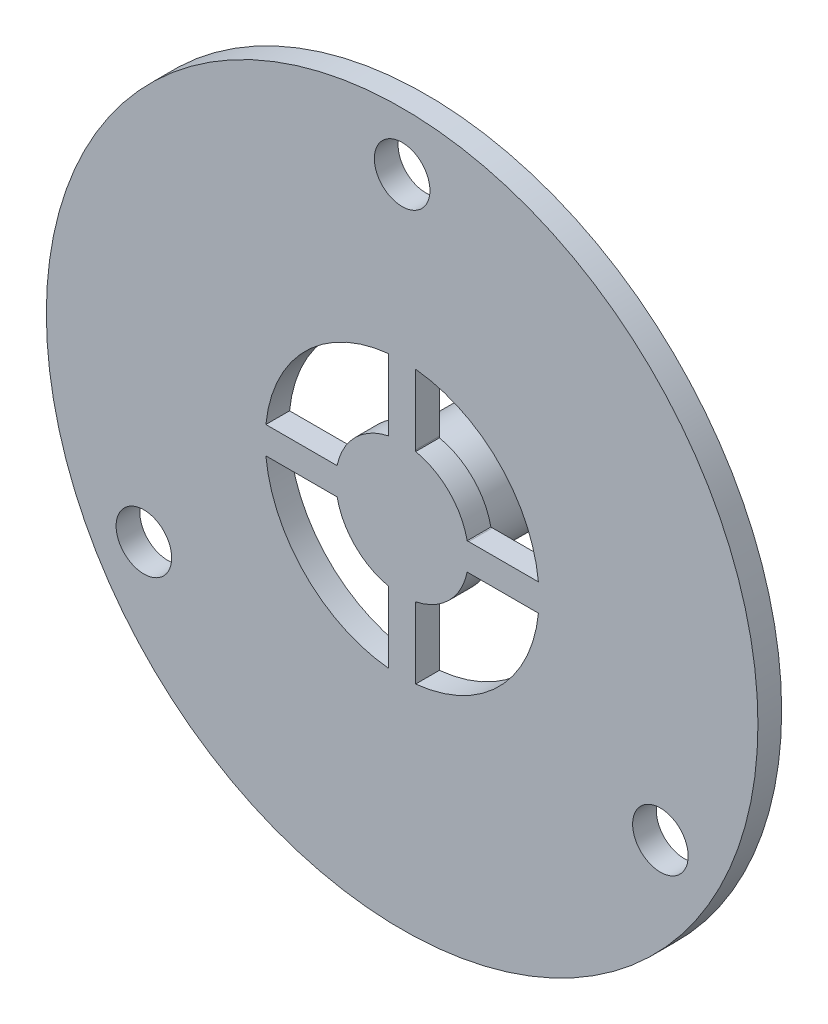
ISO-10303-21;
HEADER;
FILE_DESCRIPTION(('STEP AP214'),'2;1');
FILE_NAME('part.step','',(''),(''),'','','');
FILE_SCHEMA(('AUTOMOTIVE_DESIGN { 1 0 10303 214 1 1 1 1 }'));
ENDSEC;
DATA;
#1=APPLICATION_CONTEXT('core data for automotive mechanical design processes');
#2=APPLICATION_PROTOCOL_DEFINITION('international standard','automotive_design',2000,#1);
#3=PRODUCT_CONTEXT('',#1,'mechanical');
#4=PRODUCT('Part','Part','',(#3));
#5=PRODUCT_RELATED_PRODUCT_CATEGORY('part','',(#4));
#6=PRODUCT_DEFINITION_FORMATION('','',#4);
#7=PRODUCT_DEFINITION_CONTEXT('part definition',#1,'design');
#8=PRODUCT_DEFINITION('design','',#6,#7);
#9=PRODUCT_DEFINITION_SHAPE('','',#8);
#10=(LENGTH_UNIT() NAMED_UNIT(*) SI_UNIT(.MILLI.,.METRE.));
#11=(NAMED_UNIT(*) PLANE_ANGLE_UNIT() SI_UNIT($,.RADIAN.));
#12=(NAMED_UNIT(*) SI_UNIT($,.STERADIAN.) SOLID_ANGLE_UNIT());
#13=UNCERTAINTY_MEASURE_WITH_UNIT(LENGTH_MEASURE(1.E-05),#10,'distance_accuracy_value','');
#14=(GEOMETRIC_REPRESENTATION_CONTEXT(3) GLOBAL_UNCERTAINTY_ASSIGNED_CONTEXT((#13)) GLOBAL_UNIT_ASSIGNED_CONTEXT((#10,
#11,#12)) REPRESENTATION_CONTEXT('',''));
#15=CARTESIAN_POINT('',(0.,0.,0.));
#16=DIRECTION('',(0.,0.,1.));
#17=DIRECTION('',(1.,0.,0.));
#18=AXIS2_PLACEMENT_3D('',#15,#16,#17);
#19=CARTESIAN_POINT('',(0.,0.,11.8));
#20=DIRECTION('',(0.,0.,-1.));
#21=DIRECTION('',(-1.,0.,0.));
#22=AXIS2_PLACEMENT_3D('',#19,#20,#21);
#23=CYLINDRICAL_SURFACE('',#22,20.2072594216347);
#24=CARTESIAN_POINT('',(0.,0.,0.));
#25=DIRECTION('',(0.,0.,-1.));
#26=DIRECTION('',(-1.,0.,0.));
#27=AXIS2_PLACEMENT_3D('',#24,#25,#26);
#28=CIRCLE('',#27,20.2072594216347);
#29=CARTESIAN_POINT('',(-20.1079420213319,2.00099999999997,0.));
#30=VERTEX_POINT('',#29);
#31=CARTESIAN_POINT('',(-2.,20.1080415091387,0.));
#32=VERTEX_POINT('',#31);
#33=EDGE_CURVE('E379',#30,#32,#28,.T.);
#34=ORIENTED_EDGE('',*,*,#33,.T.);
#35=DIRECTION('',(0.,0.,-1.));
#36=VECTOR('',#35,1.);
#37=CARTESIAN_POINT('',(-2.,20.1080415091387,11.8));
#38=LINE('',#37,#36);
#39=CARTESIAN_POINT('',(-2.,20.1080415091387,3.5));
#40=VERTEX_POINT('',#39);
#41=EDGE_CURVE('E46',#32,#40,#38,.F.);
#42=ORIENTED_EDGE('',*,*,#41,.T.);
#43=CARTESIAN_POINT('',(0.,0.,3.5));
#44=DIRECTION('',(0.,0.,1.));
#45=DIRECTION('',(1.,0.,0.));
#46=AXIS2_PLACEMENT_3D('',#43,#44,#45);
#47=CIRCLE('',#46,20.2072594216347);
#48=CARTESIAN_POINT('',(-20.1079420213319,2.00099999999997,3.5));
#49=VERTEX_POINT('',#48);
#50=EDGE_CURVE('E388',#40,#49,#47,.T.);
#51=ORIENTED_EDGE('',*,*,#50,.T.);
#52=DIRECTION('',(0.,0.,-1.));
#53=VECTOR('',#52,1.);
#54=CARTESIAN_POINT('',(-20.1079420213319,2.00099999999997,11.8));
#55=LINE('',#54,#53);
#56=EDGE_CURVE('E410',#49,#30,#55,.T.);
#57=ORIENTED_EDGE('',*,*,#56,.T.);
#58=EDGE_LOOP('',(#34,#42,#51,#57));
#59=FACE_BOUND('',#58,.T.);
#60=ADVANCED_FACE('F38',(#59),#23,.F.);
#61=CARTESIAN_POINT('',(20.1081409467222,1.9990000000001,3.5));
#62=VERTEX_POINT('',#61);
#63=CARTESIAN_POINT('',(2.,20.1080415091387,3.5));
#64=VERTEX_POINT('',#63);
#65=EDGE_CURVE('E384',#62,#64,#47,.T.);
#66=ORIENTED_EDGE('',*,*,#65,.T.);
#67=DIRECTION('',(0.,0.,-1.));
#68=VECTOR('',#67,1.);
#69=CARTESIAN_POINT('',(2.,20.1080415091387,11.8));
#70=LINE('',#69,#68);
#71=CARTESIAN_POINT('',(2.,20.1080415091387,0.));
#72=VERTEX_POINT('',#71);
#73=EDGE_CURVE('E429',#64,#72,#70,.T.);
#74=ORIENTED_EDGE('',*,*,#73,.T.);
#75=CARTESIAN_POINT('',(20.1081409467222,1.9990000000001,0.));
#76=VERTEX_POINT('',#75);
#77=EDGE_CURVE('E383',#72,#76,#28,.T.);
#78=ORIENTED_EDGE('',*,*,#77,.T.);
#79=DIRECTION('',(0.,0.,-1.));
#80=VECTOR('',#79,1.);
#81=CARTESIAN_POINT('',(20.1081409467222,1.9990000000001,11.8));
#82=LINE('',#81,#80);
#83=EDGE_CURVE('E426',#76,#62,#82,.F.);
#84=ORIENTED_EDGE('',*,*,#83,.T.);
#85=EDGE_LOOP('',(#66,#74,#78,#84));
#86=FACE_BOUND('',#85,.T.);
#87=ADVANCED_FACE('F505',(#86),#23,.F.);
#88=CARTESIAN_POINT('',(1.99800000000007,-20.1082403340831,3.5));
#89=VERTEX_POINT('',#88);
#90=CARTESIAN_POINT('',(20.1079420213319,-2.0009999999999,3.5));
#91=VERTEX_POINT('',#90);
#92=EDGE_CURVE('E382',#89,#91,#47,.T.);
#93=ORIENTED_EDGE('',*,*,#92,.T.);
#94=DIRECTION('',(0.,0.,-1.));
#95=VECTOR('',#94,1.);
#96=CARTESIAN_POINT('',(20.1079420213319,-2.0009999999999,11.8));
#97=LINE('',#96,#95);
#98=CARTESIAN_POINT('',(20.1079420213319,-2.0009999999999,0.));
#99=VERTEX_POINT('',#98);
#100=EDGE_CURVE('E423',#91,#99,#97,.T.);
#101=ORIENTED_EDGE('',*,*,#100,.T.);
#102=CARTESIAN_POINT('',(1.99800000000007,-20.1082403340831,0.));
#103=VERTEX_POINT('',#102);
#104=EDGE_CURVE('E465',#99,#103,#28,.T.);
#105=ORIENTED_EDGE('',*,*,#104,.T.);
#106=DIRECTION('',(0.,0.,-1.));
#107=VECTOR('',#106,1.);
#108=CARTESIAN_POINT('',(1.99800000000007,-20.1082403340831,11.8));
#109=LINE('',#108,#107);
#110=EDGE_CURVE('E420',#103,#89,#109,.F.);
#111=ORIENTED_EDGE('',*,*,#110,.T.);
#112=EDGE_LOOP('',(#93,#101,#105,#111));
#113=FACE_BOUND('',#112,.T.);
#114=ADVANCED_FACE('F450',(#113),#23,.F.);
#115=CARTESIAN_POINT('',(0.,0.,3.5));
#116=DIRECTION('',(0.,0.,1.));
#117=DIRECTION('',(1.,0.,0.));
#118=AXIS2_PLACEMENT_3D('',#115,#116,#117);
#119=PLANE('',#118);
#120=ORIENTED_EDGE('',*,*,#50,.F.);
#121=DIRECTION('',(0.,1.,0.));
#122=VECTOR('',#121,1.);
#123=CARTESIAN_POINT('',(-2.,9.80418614976454,3.5));
#124=LINE('',#123,#122);
#125=CARTESIAN_POINT('',(-2.,9.80418614976454,3.5));
#126=VERTEX_POINT('',#125);
#127=EDGE_CURVE('E240',#126,#40,#124,.T.);
#128=ORIENTED_EDGE('',*,*,#127,.F.);
#129=DIRECTION('',(0.000101997246838848,0.999999994798281,0.));
#130=VECTOR('',#129,1.);
#131=CARTESIAN_POINT('',(-2.,9.80418614976454,3.5));
#132=LINE('',#131,#130);
#133=CARTESIAN_POINT('',(-2.00002102841153,9.59801968872468,3.5));
#134=VERTEX_POINT('',#133);
#135=EDGE_CURVE('E294',#134,#126,#132,.T.);
#136=ORIENTED_EDGE('',*,*,#135,.F.);
#137=CARTESIAN_POINT('',(0.,0.,3.5));
#138=DIRECTION('',(0.,0.,1.));
#139=DIRECTION('',(1.,0.,0.));
#140=AXIS2_PLACEMENT_3D('',#137,#138,#139);
#141=CIRCLE('',#140,9.80418614976454);
#142=CARTESIAN_POINT('',(-9.59782004958287,2.00097884922855,3.5));
#143=VERTEX_POINT('',#142);
#144=EDGE_CURVE('E299',#143,#134,#141,.F.);
#145=ORIENTED_EDGE('',*,*,#144,.F.);
#146=DIRECTION('',(0.999999994798281,-0.000101997246835377,0.));
#147=VECTOR('',#146,1.);
#148=CARTESIAN_POINT('',(-9.59782004958287,2.00097884922855,3.5));
#149=LINE('',#148,#147);
#150=CARTESIAN_POINT('',(-9.80518614976454,2.00099999999997,3.5));
#151=VERTEX_POINT('',#150);
#152=EDGE_CURVE('E303',#151,#143,#149,.T.);
#153=ORIENTED_EDGE('',*,*,#152,.F.);
#154=DIRECTION('',(1.,0.,0.));
#155=VECTOR('',#154,1.);
#156=CARTESIAN_POINT('',(-9.80518614976454,2.00099999999997,3.5));
#157=LINE('',#156,#155);
#158=EDGE_CURVE('E307',#49,#151,#157,.T.);
#159=ORIENTED_EDGE('',*,*,#158,.F.);
#160=EDGE_LOOP('',(#120,#128,#136,#145,#153,#159));
#161=FACE_BOUND('',#160,.T.);
#162=ORIENTED_EDGE('',*,*,#65,.F.);
#163=DIRECTION('',(1.,0.,0.));
#164=VECTOR('',#163,1.);
#165=CARTESIAN_POINT('',(9.80318614976454,1.9990000000001,3.5));
#166=LINE('',#165,#164);
#167=CARTESIAN_POINT('',(9.80318614976454,1.9990000000001,3.5));
#168=VERTEX_POINT('',#167);
#169=EDGE_CURVE('E343',#168,#62,#166,.T.);
#170=ORIENTED_EDGE('',*,*,#169,.F.);
#171=DIRECTION('',(0.999999994798281,-0.000101997246835749,0.));
#172=VECTOR('',#171,1.);
#173=CARTESIAN_POINT('',(9.80318614976454,1.9990000000001,3.5));
#174=LINE('',#173,#172);
#175=CARTESIAN_POINT('',(9.59822803854727,1.99902090516327,3.5));
#176=VERTEX_POINT('',#175);
#177=EDGE_CURVE('E346',#176,#168,#174,.T.);
#178=ORIENTED_EDGE('',*,*,#177,.F.);
#179=CARTESIAN_POINT('',(0.,0.,3.5));
#180=DIRECTION('',(0.,0.,1.));
#181=DIRECTION('',(1.,0.,0.));
#182=AXIS2_PLACEMENT_3D('',#179,#180,#181);
#183=CIRCLE('',#182,9.80418614976454);
#184=CARTESIAN_POINT('',(1.99997897248232,9.59802845218035,3.5));
#185=VERTEX_POINT('',#184);
#186=EDGE_CURVE('E350',#185,#176,#183,.F.);
#187=ORIENTED_EDGE('',*,*,#186,.F.);
#188=DIRECTION('',(-0.00010199724683881,-0.999999994798281,0.));
#189=VECTOR('',#188,1.);
#190=CARTESIAN_POINT('',(2.,9.80418614976454,3.5));
#191=LINE('',#190,#189);
#192=CARTESIAN_POINT('',(2.,9.80418614976454,3.5));
#193=VERTEX_POINT('',#192);
#194=EDGE_CURVE('E354',#193,#185,#191,.T.);
#195=ORIENTED_EDGE('',*,*,#194,.F.);
#196=DIRECTION('',(0.,-1.,0.));
#197=VECTOR('',#196,1.);
#198=CARTESIAN_POINT('',(2.,9.80418614976454,3.5));
#199=LINE('',#198,#197);
#200=EDGE_CURVE('E293',#64,#193,#199,.T.);
#201=ORIENTED_EDGE('',*,*,#200,.F.);
#202=EDGE_LOOP('',(#162,#170,#178,#187,#195,#201));
#203=FACE_BOUND('',#202,.T.);
#204=ORIENTED_EDGE('',*,*,#92,.F.);
#205=DIRECTION('',(0.,-1.,0.));
#206=VECTOR('',#205,1.);
#207=CARTESIAN_POINT('',(1.99800000000007,-9.80418614976454,3.5));
#208=LINE('',#207,#206);
#209=CARTESIAN_POINT('',(1.99800000000007,-9.80418614976454,3.5));
#210=VERTEX_POINT('',#209);
#211=EDGE_CURVE('E326',#210,#89,#208,.T.);
#212=ORIENTED_EDGE('',*,*,#211,.F.);
#213=DIRECTION('',(-0.000101997246838998,-0.999999994798281,0.));
#214=VECTOR('',#213,1.);
#215=CARTESIAN_POINT('',(1.9980209859248,-9.59843623717108,3.5));
#216=LINE('',#215,#214);
#217=CARTESIAN_POINT('',(1.9980209859248,-9.59843623717108,3.5));
#218=VERTEX_POINT('',#217);
#219=EDGE_CURVE('E329',#218,#210,#216,.T.);
#220=ORIENTED_EDGE('',*,*,#219,.F.);
#221=CARTESIAN_POINT('',(0.,0.,3.5));
#222=DIRECTION('',(0.,0.,1.));
#223=DIRECTION('',(1.,0.,0.));
#224=AXIS2_PLACEMENT_3D('',#221,#222,#223);
#225=CIRCLE('',#224,9.80418614976454);
#226=CARTESIAN_POINT('',(9.59782000705447,-2.00097905321864,3.5));
#227=VERTEX_POINT('',#226);
#228=EDGE_CURVE('E333',#227,#218,#225,.F.);
#229=ORIENTED_EDGE('',*,*,#228,.F.);
#230=DIRECTION('',(-0.999999994798281,0.000101997246834019,0.));
#231=VECTOR('',#230,1.);
#232=CARTESIAN_POINT('',(9.80318614976454,-2.0009999999999,3.5));
#233=LINE('',#232,#231);
#234=CARTESIAN_POINT('',(9.80318614976454,-2.0009999999999,3.5));
#235=VERTEX_POINT('',#234);
#236=EDGE_CURVE('E337',#235,#227,#233,.T.);
#237=ORIENTED_EDGE('',*,*,#236,.F.);
#238=DIRECTION('',(-1.,0.,0.));
#239=VECTOR('',#238,1.);
#240=CARTESIAN_POINT('',(9.80318614976454,-2.0009999999999,3.5));
#241=LINE('',#240,#239);
#242=EDGE_CURVE('E341',#91,#235,#241,.T.);
#243=ORIENTED_EDGE('',*,*,#242,.F.);
#244=EDGE_LOOP('',(#204,#212,#220,#229,#237,#243));
#245=FACE_BOUND('',#244,.T.);
#246=CARTESIAN_POINT('',(-20.1081409467222,-1.99900000000003,3.5));
#247=VERTEX_POINT('',#246);
#248=CARTESIAN_POINT('',(-2.00199999999993,-20.107842483301,3.5));
#249=VERTEX_POINT('',#248);
#250=EDGE_CURVE('E443',#247,#249,#47,.T.);
#251=ORIENTED_EDGE('',*,*,#250,.F.);
#252=DIRECTION('',(-1.,0.,0.));
#253=VECTOR('',#252,1.);
#254=CARTESIAN_POINT('',(-9.80518614976454,-1.99900000000003,3.5));
#255=LINE('',#254,#253);
#256=CARTESIAN_POINT('',(-9.80518614976454,-1.99900000000003,3.5));
#257=VERTEX_POINT('',#256);
#258=EDGE_CURVE('E309',#257,#247,#255,.T.);
#259=ORIENTED_EDGE('',*,*,#258,.F.);
#260=DIRECTION('',(-0.999999994798281,0.000101997246833554,0.));
#261=VECTOR('',#260,1.);
#262=CARTESIAN_POINT('',(-9.59822799606049,-1.99902110916203,3.5));
#263=LINE('',#262,#261);
#264=CARTESIAN_POINT('',(-9.59822799606049,-1.99902110916203,3.5));
#265=VERTEX_POINT('',#264);
#266=EDGE_CURVE('E312',#265,#257,#263,.T.);
#267=ORIENTED_EDGE('',*,*,#266,.F.);
#268=CARTESIAN_POINT('',(0.,0.,3.5));
#269=DIRECTION('',(0.,0.,1.));
#270=DIRECTION('',(1.,0.,0.));
#271=AXIS2_PLACEMENT_3D('',#268,#269,#270);
#272=CIRCLE('',#271,9.80418614976454);
#273=CARTESIAN_POINT('',(-2.00197892995385,-9.59761149574495,3.5));
#274=VERTEX_POINT('',#273);
#275=EDGE_CURVE('E316',#274,#265,#272,.F.);
#276=ORIENTED_EDGE('',*,*,#275,.F.);
#277=DIRECTION('',(0.000101997246839116,0.999999994798281,0.));
#278=VECTOR('',#277,1.);
#279=CARTESIAN_POINT('',(-2.00197892995385,-9.59761149574495,3.5));
#280=LINE('',#279,#278);
#281=CARTESIAN_POINT('',(-2.00199999999993,-9.80418614976454,3.5));
#282=VERTEX_POINT('',#281);
#283=EDGE_CURVE('E320',#282,#274,#280,.T.);
#284=ORIENTED_EDGE('',*,*,#283,.F.);
#285=DIRECTION('',(0.,1.,0.));
#286=VECTOR('',#285,1.);
#287=CARTESIAN_POINT('',(-2.00199999999993,-9.80418614976454,3.5));
#288=LINE('',#287,#286);
#289=EDGE_CURVE('E324',#249,#282,#288,.T.);
#290=ORIENTED_EDGE('',*,*,#289,.F.);
#291=EDGE_LOOP('',(#251,#259,#267,#276,#284,#290));
#292=FACE_BOUND('',#291,.T.);
#293=CARTESIAN_POINT('',(38.1051177665152,-22.0000000000002,3.5));
#294=DIRECTION('',(0.,0.,1.));
#295=DIRECTION('',(1.,0.,0.));
#296=AXIS2_PLACEMENT_3D('',#293,#294,#295);
#297=CIRCLE('',#296,4.09999999999997);
#298=CARTESIAN_POINT('',(42.2051177665152,-22.0000000000002,3.5));
#299=VERTEX_POINT('',#298);
#300=EDGE_CURVE('E395',#299,#299,#297,.T.);
#301=ORIENTED_EDGE('',*,*,#300,.F.);
#302=EDGE_LOOP('',(#301));
#303=FACE_BOUND('',#302,.T.);
#304=CARTESIAN_POINT('',(0.,0.,3.5));
#305=DIRECTION('',(0.,0.,1.));
#306=DIRECTION('',(1.,0.,0.));
#307=AXIS2_PLACEMENT_3D('',#304,#305,#306);
#308=CIRCLE('',#307,52.5);
#309=CARTESIAN_POINT('',(52.5,0.,3.5));
#310=VERTEX_POINT('',#309);
#311=EDGE_CURVE('E407',#310,#310,#308,.T.);
#312=ORIENTED_EDGE('',*,*,#311,.T.);
#313=EDGE_LOOP('',(#312));
#314=FACE_BOUND('',#313,.T.);
#315=CARTESIAN_POINT('',(0.,44.,3.5));
#316=DIRECTION('',(0.,0.,1.));
#317=DIRECTION('',(1.,0.,0.));
#318=AXIS2_PLACEMENT_3D('',#315,#316,#317);
#319=CIRCLE('',#318,4.1);
#320=CARTESIAN_POINT('',(4.10000000000001,44.,3.5));
#321=VERTEX_POINT('',#320);
#322=EDGE_CURVE('E401',#321,#321,#319,.T.);
#323=ORIENTED_EDGE('',*,*,#322,.F.);
#324=EDGE_LOOP('',(#323));
#325=FACE_BOUND('',#324,.T.);
#326=CARTESIAN_POINT('',(-38.1051177665152,-22.0000000000002,3.5));
#327=DIRECTION('',(0.,0.,1.));
#328=DIRECTION('',(1.,0.,0.));
#329=AXIS2_PLACEMENT_3D('',#326,#327,#328);
#330=CIRCLE('',#329,4.10000000000001);
#331=CARTESIAN_POINT('',(-34.0051177665152,-22.0000000000002,3.5));
#332=VERTEX_POINT('',#331);
#333=EDGE_CURVE('E389',#332,#332,#330,.T.);
#334=ORIENTED_EDGE('',*,*,#333,.F.);
#335=EDGE_LOOP('',(#334));
#336=FACE_BOUND('',#335,.T.);
#337=ADVANCED_FACE('F440',(#161,#203,#245,#292,#303,#314,#325,#336),#119,.T.);
#338=CARTESIAN_POINT('',(0.,0.,0.));
#339=DIRECTION('',(0.,0.,1.));
#340=DIRECTION('',(1.,0.,0.));
#341=AXIS2_PLACEMENT_3D('',#338,#339,#340);
#342=PLANE('',#341);
#343=CARTESIAN_POINT('',(0.,0.,0.));
#344=DIRECTION('',(0.,0.,1.));
#345=DIRECTION('',(1.,0.,0.));
#346=AXIS2_PLACEMENT_3D('',#343,#344,#345);
#347=CIRCLE('',#346,7.78176214693333);
#348=CARTESIAN_POINT('',(7.78176214693333,0.,0.));
#349=VERTEX_POINT('',#348);
#350=EDGE_CURVE('E11',#349,#349,#347,.F.);
#351=ORIENTED_EDGE('',*,*,#350,.F.);
#352=EDGE_LOOP('',(#351));
#353=FACE_BOUND('',#352,.T.);
#354=DIRECTION('',(0.,1.,0.));
#355=VECTOR('',#354,1.);
#356=CARTESIAN_POINT('',(-2.,9.80418614976454,0.));
#357=LINE('',#356,#355);
#358=CARTESIAN_POINT('',(-2.,9.80418614976454,0.));
#359=VERTEX_POINT('',#358);
#360=EDGE_CURVE('E287',#359,#32,#357,.T.);
#361=ORIENTED_EDGE('',*,*,#360,.T.);
#362=ORIENTED_EDGE('',*,*,#33,.F.);
#363=DIRECTION('',(1.,0.,0.));
#364=VECTOR('',#363,1.);
#365=CARTESIAN_POINT('',(-9.80518614976454,2.00099999999997,0.));
#366=LINE('',#365,#364);
#367=CARTESIAN_POINT('',(-9.80518614976454,2.00099999999997,0.));
#368=VERTEX_POINT('',#367);
#369=EDGE_CURVE('E244',#30,#368,#366,.T.);
#370=ORIENTED_EDGE('',*,*,#369,.T.);
#371=DIRECTION('',(0.999999994798281,-0.000101997246835377,0.));
#372=VECTOR('',#371,1.);
#373=CARTESIAN_POINT('',(-9.59782004958287,2.00097884922855,0.));
#374=LINE('',#373,#372);
#375=CARTESIAN_POINT('',(-9.59782004958287,2.00097884922855,0.));
#376=VERTEX_POINT('',#375);
#377=EDGE_CURVE('E241',#368,#376,#374,.T.);
#378=ORIENTED_EDGE('',*,*,#377,.T.);
#379=CARTESIAN_POINT('',(0.,0.,0.));
#380=DIRECTION('',(0.,0.,-1.));
#381=DIRECTION('',(-1.,0.,0.));
#382=AXIS2_PLACEMENT_3D('',#379,#380,#381);
#383=CIRCLE('',#382,9.80418614976454);
#384=CARTESIAN_POINT('',(-2.00002102841153,9.59801968872468,0.));
#385=VERTEX_POINT('',#384);
#386=EDGE_CURVE('E237',#376,#385,#383,.T.);
#387=ORIENTED_EDGE('',*,*,#386,.T.);
#388=DIRECTION('',(0.000101997246838848,0.999999994798281,0.));
#389=VECTOR('',#388,1.);
#390=CARTESIAN_POINT('',(-2.,9.80418614976454,0.));
#391=LINE('',#390,#389);
#392=EDGE_CURVE('E219',#385,#359,#391,.T.);
#393=ORIENTED_EDGE('',*,*,#392,.T.);
#394=EDGE_LOOP('',(#361,#362,#370,#378,#387,#393));
#395=FACE_BOUND('',#394,.T.);
#396=DIRECTION('',(1.,0.,0.));
#397=VECTOR('',#396,1.);
#398=CARTESIAN_POINT('',(9.80318614976454,1.9990000000001,0.));
#399=LINE('',#398,#397);
#400=CARTESIAN_POINT('',(9.80318614976454,1.9990000000001,0.));
#401=VERTEX_POINT('',#400);
#402=EDGE_CURVE('E273',#401,#76,#399,.T.);
#403=ORIENTED_EDGE('',*,*,#402,.T.);
#404=ORIENTED_EDGE('',*,*,#77,.F.);
#405=DIRECTION('',(0.,-1.,0.));
#406=VECTOR('',#405,1.);
#407=CARTESIAN_POINT('',(2.,9.80418614976454,0.));
#408=LINE('',#407,#406);
#409=CARTESIAN_POINT('',(2.,9.80418614976454,0.));
#410=VERTEX_POINT('',#409);
#411=EDGE_CURVE('E285',#72,#410,#408,.T.);
#412=ORIENTED_EDGE('',*,*,#411,.T.);
#413=DIRECTION('',(-0.00010199724683881,-0.999999994798281,0.));
#414=VECTOR('',#413,1.);
#415=CARTESIAN_POINT('',(2.,9.80418614976454,0.));
#416=LINE('',#415,#414);
#417=CARTESIAN_POINT('',(1.99997897248232,9.59802845218035,0.));
#418=VERTEX_POINT('',#417);
#419=EDGE_CURVE('E282',#410,#418,#416,.T.);
#420=ORIENTED_EDGE('',*,*,#419,.T.);
#421=CARTESIAN_POINT('',(0.,0.,0.));
#422=DIRECTION('',(0.,0.,-1.));
#423=DIRECTION('',(-1.,0.,0.));
#424=AXIS2_PLACEMENT_3D('',#421,#422,#423);
#425=CIRCLE('',#424,9.80418614976454);
#426=CARTESIAN_POINT('',(9.59822803854727,1.99902090516327,0.));
#427=VERTEX_POINT('',#426);
#428=EDGE_CURVE('E279',#418,#427,#425,.T.);
#429=ORIENTED_EDGE('',*,*,#428,.T.);
#430=DIRECTION('',(0.999999994798281,-0.000101997246835749,0.));
#431=VECTOR('',#430,1.);
#432=CARTESIAN_POINT('',(9.80318614976454,1.9990000000001,0.));
#433=LINE('',#432,#431);
#434=EDGE_CURVE('E276',#427,#401,#433,.T.);
#435=ORIENTED_EDGE('',*,*,#434,.T.);
#436=EDGE_LOOP('',(#403,#404,#412,#420,#429,#435));
#437=FACE_BOUND('',#436,.T.);
#438=DIRECTION('',(0.,-1.,0.));
#439=VECTOR('',#438,1.);
#440=CARTESIAN_POINT('',(1.99800000000007,-9.80418614976454,0.));
#441=LINE('',#440,#439);
#442=CARTESIAN_POINT('',(1.99800000000007,-9.80418614976454,0.));
#443=VERTEX_POINT('',#442);
#444=EDGE_CURVE('E259',#443,#103,#441,.T.);
#445=ORIENTED_EDGE('',*,*,#444,.T.);
#446=ORIENTED_EDGE('',*,*,#104,.F.);
#447=DIRECTION('',(-1.,0.,0.));
#448=VECTOR('',#447,1.);
#449=CARTESIAN_POINT('',(9.80318614976454,-2.0009999999999,0.));
#450=LINE('',#449,#448);
#451=CARTESIAN_POINT('',(9.80318614976454,-2.0009999999999,0.));
#452=VERTEX_POINT('',#451);
#453=EDGE_CURVE('E271',#99,#452,#450,.T.);
#454=ORIENTED_EDGE('',*,*,#453,.T.);
#455=DIRECTION('',(-0.999999994798281,0.000101997246834019,0.));
#456=VECTOR('',#455,1.);
#457=CARTESIAN_POINT('',(9.80318614976454,-2.0009999999999,0.));
#458=LINE('',#457,#456);
#459=CARTESIAN_POINT('',(9.59782000705447,-2.00097905321864,0.));
#460=VERTEX_POINT('',#459);
#461=EDGE_CURVE('E268',#452,#460,#458,.T.);
#462=ORIENTED_EDGE('',*,*,#461,.T.);
#463=CARTESIAN_POINT('',(0.,0.,0.));
#464=DIRECTION('',(0.,0.,-1.));
#465=DIRECTION('',(-1.,0.,0.));
#466=AXIS2_PLACEMENT_3D('',#463,#464,#465);
#467=CIRCLE('',#466,9.80418614976454);
#468=CARTESIAN_POINT('',(1.9980209859248,-9.59843623717108,0.));
#469=VERTEX_POINT('',#468);
#470=EDGE_CURVE('E265',#460,#469,#467,.T.);
#471=ORIENTED_EDGE('',*,*,#470,.T.);
#472=DIRECTION('',(-0.000101997246838998,-0.999999994798281,0.));
#473=VECTOR('',#472,1.);
#474=CARTESIAN_POINT('',(1.9980209859248,-9.59843623717108,0.));
#475=LINE('',#474,#473);
#476=EDGE_CURVE('E262',#469,#443,#475,.T.);
#477=ORIENTED_EDGE('',*,*,#476,.T.);
#478=EDGE_LOOP('',(#445,#446,#454,#462,#471,#477));
#479=FACE_BOUND('',#478,.T.);
#480=DIRECTION('',(-1.,0.,0.));
#481=VECTOR('',#480,1.);
#482=CARTESIAN_POINT('',(-9.80518614976454,-1.99900000000003,0.));
#483=LINE('',#482,#481);
#484=CARTESIAN_POINT('',(-9.80518614976454,-1.99900000000003,0.));
#485=VERTEX_POINT('',#484);
#486=CARTESIAN_POINT('',(-20.1081409467222,-1.99900000000003,0.));
#487=VERTEX_POINT('',#486);
#488=EDGE_CURVE('E246',#485,#487,#483,.T.);
#489=ORIENTED_EDGE('',*,*,#488,.T.);
#490=CARTESIAN_POINT('',(-2.00199999999993,-20.107842483301,0.));
#491=VERTEX_POINT('',#490);
#492=EDGE_CURVE('E378',#491,#487,#28,.T.);
#493=ORIENTED_EDGE('',*,*,#492,.F.);
#494=DIRECTION('',(0.,1.,0.));
#495=VECTOR('',#494,1.);
#496=CARTESIAN_POINT('',(-2.00199999999993,-9.80418614976454,0.));
#497=LINE('',#496,#495);
#498=CARTESIAN_POINT('',(-2.00199999999993,-9.80418614976454,0.));
#499=VERTEX_POINT('',#498);
#500=EDGE_CURVE('E60',#491,#499,#497,.T.);
#501=ORIENTED_EDGE('',*,*,#500,.T.);
#502=DIRECTION('',(0.000101997246839116,0.999999994798281,0.));
#503=VECTOR('',#502,1.);
#504=CARTESIAN_POINT('',(-2.00197892995385,-9.59761149574495,0.));
#505=LINE('',#504,#503);
#506=CARTESIAN_POINT('',(-2.00197892995385,-9.59761149574495,0.));
#507=VERTEX_POINT('',#506);
#508=EDGE_CURVE('E255',#499,#507,#505,.T.);
#509=ORIENTED_EDGE('',*,*,#508,.T.);
#510=CARTESIAN_POINT('',(0.,0.,0.));
#511=DIRECTION('',(0.,0.,-1.));
#512=DIRECTION('',(-1.,0.,0.));
#513=AXIS2_PLACEMENT_3D('',#510,#511,#512);
#514=CIRCLE('',#513,9.80418614976454);
#515=CARTESIAN_POINT('',(-9.59822799606049,-1.99902110916203,0.));
#516=VERTEX_POINT('',#515);
#517=EDGE_CURVE('E252',#507,#516,#514,.T.);
#518=ORIENTED_EDGE('',*,*,#517,.T.);
#519=DIRECTION('',(-0.999999994798281,0.000101997246833554,0.));
#520=VECTOR('',#519,1.);
#521=CARTESIAN_POINT('',(-9.59822799606049,-1.99902110916203,0.));
#522=LINE('',#521,#520);
#523=EDGE_CURVE('E249',#516,#485,#522,.T.);
#524=ORIENTED_EDGE('',*,*,#523,.T.);
#525=EDGE_LOOP('',(#489,#493,#501,#509,#518,#524));
#526=FACE_BOUND('',#525,.T.);
#527=CARTESIAN_POINT('',(-38.1051177665152,-22.0000000000002,0.));
#528=DIRECTION('',(0.,0.,1.));
#529=DIRECTION('',(1.,0.,0.));
#530=AXIS2_PLACEMENT_3D('',#527,#528,#529);
#531=CIRCLE('',#530,4.10000000000001);
#532=CARTESIAN_POINT('',(-34.0051177665152,-22.0000000000002,0.));
#533=VERTEX_POINT('',#532);
#534=EDGE_CURVE('E387',#533,#533,#531,.T.);
#535=ORIENTED_EDGE('',*,*,#534,.T.);
#536=EDGE_LOOP('',(#535));
#537=FACE_BOUND('',#536,.T.);
#538=CARTESIAN_POINT('',(38.1051177665152,-22.0000000000002,0.));
#539=DIRECTION('',(0.,0.,1.));
#540=DIRECTION('',(1.,0.,0.));
#541=AXIS2_PLACEMENT_3D('',#538,#539,#540);
#542=CIRCLE('',#541,4.09999999999997);
#543=CARTESIAN_POINT('',(42.2051177665152,-22.0000000000002,0.));
#544=VERTEX_POINT('',#543);
#545=EDGE_CURVE('E392',#544,#544,#542,.T.);
#546=ORIENTED_EDGE('',*,*,#545,.T.);
#547=EDGE_LOOP('',(#546));
#548=FACE_BOUND('',#547,.T.);
#549=CARTESIAN_POINT('',(0.,44.,0.));
#550=DIRECTION('',(0.,0.,1.));
#551=DIRECTION('',(1.,0.,0.));
#552=AXIS2_PLACEMENT_3D('',#549,#550,#551);
#553=CIRCLE('',#552,4.1);
#554=CARTESIAN_POINT('',(4.10000000000001,44.,0.));
#555=VERTEX_POINT('',#554);
#556=EDGE_CURVE('E398',#555,#555,#553,.T.);
#557=ORIENTED_EDGE('',*,*,#556,.T.);
#558=EDGE_LOOP('',(#557));
#559=FACE_BOUND('',#558,.T.);
#560=CARTESIAN_POINT('',(0.,0.,0.));
#561=DIRECTION('',(0.,0.,1.));
#562=DIRECTION('',(1.,0.,0.));
#563=AXIS2_PLACEMENT_3D('',#560,#561,#562);
#564=CIRCLE('',#563,52.5);
#565=CARTESIAN_POINT('',(52.5,0.,0.));
#566=VERTEX_POINT('',#565);
#567=EDGE_CURVE('E404',#566,#566,#564,.T.);
#568=ORIENTED_EDGE('',*,*,#567,.F.);
#569=EDGE_LOOP('',(#568));
#570=FACE_BOUND('',#569,.T.);
#571=ADVANCED_FACE('F463',(#353,#395,#437,#479,#526,#537,#548,#559,#570),#342,.F.);
#572=CARTESIAN_POINT('',(0.,0.,3.5));
#573=DIRECTION('',(0.,0.,-1.));
#574=DIRECTION('',(-1.,0.,0.));
#575=AXIS2_PLACEMENT_3D('',#572,#573,#574);
#576=CYLINDRICAL_SURFACE('',#575,52.5);
#577=ORIENTED_EDGE('',*,*,#311,.F.);
#578=EDGE_LOOP('',(#577));
#579=FACE_BOUND('',#578,.T.);
#580=ORIENTED_EDGE('',*,*,#567,.T.);
#581=EDGE_LOOP('',(#580));
#582=FACE_BOUND('',#581,.T.);
#583=ADVANCED_FACE('F40',(#579,#582),#576,.T.);
#584=CARTESIAN_POINT('',(0.,44.,3.5));
#585=DIRECTION('',(0.,0.,-1.));
#586=DIRECTION('',(-1.,0.,0.));
#587=AXIS2_PLACEMENT_3D('',#584,#585,#586);
#588=CYLINDRICAL_SURFACE('',#587,4.1);
#589=ORIENTED_EDGE('',*,*,#322,.T.);
#590=EDGE_LOOP('',(#589));
#591=FACE_BOUND('',#590,.T.);
#592=ORIENTED_EDGE('',*,*,#556,.F.);
#593=EDGE_LOOP('',(#592));
#594=FACE_BOUND('',#593,.T.);
#595=ADVANCED_FACE('F534',(#591,#594),#588,.F.);
#596=CARTESIAN_POINT('',(38.1051177665152,-22.0000000000002,3.5));
#597=DIRECTION('',(0.,0.,-1.));
#598=DIRECTION('',(-1.,0.,0.));
#599=AXIS2_PLACEMENT_3D('',#596,#597,#598);
#600=CYLINDRICAL_SURFACE('',#599,4.09999999999997);
#601=ORIENTED_EDGE('',*,*,#300,.T.);
#602=EDGE_LOOP('',(#601));
#603=FACE_BOUND('',#602,.T.);
#604=ORIENTED_EDGE('',*,*,#545,.F.);
#605=EDGE_LOOP('',(#604));
#606=FACE_BOUND('',#605,.T.);
#607=ADVANCED_FACE('F521',(#603,#606),#600,.F.);
#608=CARTESIAN_POINT('',(-38.1051177665152,-22.0000000000002,3.5));
#609=DIRECTION('',(0.,0.,-1.));
#610=DIRECTION('',(-1.,0.,0.));
#611=AXIS2_PLACEMENT_3D('',#608,#609,#610);
#612=CYLINDRICAL_SURFACE('',#611,4.10000000000001);
#613=ORIENTED_EDGE('',*,*,#333,.T.);
#614=EDGE_LOOP('',(#613));
#615=FACE_BOUND('',#614,.T.);
#616=ORIENTED_EDGE('',*,*,#534,.F.);
#617=EDGE_LOOP('',(#616));
#618=FACE_BOUND('',#617,.T.);
#619=ADVANCED_FACE('F515',(#615,#618),#612,.F.);
#620=ORIENTED_EDGE('',*,*,#250,.T.);
#621=DIRECTION('',(0.,0.,-1.));
#622=VECTOR('',#621,1.);
#623=CARTESIAN_POINT('',(-2.00199999999993,-20.107842483301,11.8));
#624=LINE('',#623,#622);
#625=EDGE_CURVE('E418',#249,#491,#624,.T.);
#626=ORIENTED_EDGE('',*,*,#625,.T.);
#627=ORIENTED_EDGE('',*,*,#492,.T.);
#628=DIRECTION('',(0.,0.,-1.));
#629=VECTOR('',#628,1.);
#630=CARTESIAN_POINT('',(-20.1081409467222,-1.99900000000003,11.8));
#631=LINE('',#630,#629);
#632=EDGE_CURVE('E415',#487,#247,#631,.F.);
#633=ORIENTED_EDGE('',*,*,#632,.T.);
#634=EDGE_LOOP('',(#620,#626,#627,#633));
#635=FACE_BOUND('',#634,.T.);
#636=ADVANCED_FACE('F470',(#635),#23,.F.);
#637=CARTESIAN_POINT('',(-2.,9.80418614976454,100.811067114925));
#638=DIRECTION('',(-1.,0.,0.));
#639=DIRECTION('',(0.,0.,1.));
#640=AXIS2_PLACEMENT_3D('',#637,#638,#639);
#641=PLANE('',#640);
#642=ORIENTED_EDGE('',*,*,#41,.F.);
#643=ORIENTED_EDGE('',*,*,#360,.F.);
#644=DIRECTION('',(0.,0.,-1.));
#645=VECTOR('',#644,1.);
#646=CARTESIAN_POINT('',(-2.,9.80418614976454,100.811067114925));
#647=LINE('',#646,#645);
#648=EDGE_CURVE('E297',#126,#359,#647,.T.);
#649=ORIENTED_EDGE('',*,*,#648,.F.);
#650=ORIENTED_EDGE('',*,*,#127,.T.);
#651=EDGE_LOOP('',(#642,#643,#649,#650));
#652=FACE_BOUND('',#651,.T.);
#653=ADVANCED_FACE('F514',(#652),#641,.T.);
#654=CARTESIAN_POINT('',(2.,9.80418614976454,100.811067114925));
#655=DIRECTION('',(1.,0.,0.));
#656=DIRECTION('',(0.,0.,-1.));
#657=AXIS2_PLACEMENT_3D('',#654,#655,#656);
#658=PLANE('',#657);
#659=ORIENTED_EDGE('',*,*,#73,.F.);
#660=ORIENTED_EDGE('',*,*,#200,.T.);
#661=DIRECTION('',(0.,0.,-1.));
#662=VECTOR('',#661,1.);
#663=CARTESIAN_POINT('',(2.,9.80418614976454,100.811067114925));
#664=LINE('',#663,#662);
#665=EDGE_CURVE('E357',#193,#410,#664,.T.);
#666=ORIENTED_EDGE('',*,*,#665,.T.);
#667=ORIENTED_EDGE('',*,*,#411,.F.);
#668=EDGE_LOOP('',(#659,#660,#666,#667));
#669=FACE_BOUND('',#668,.T.);
#670=ADVANCED_FACE('F520',(#669),#658,.T.);
#671=CARTESIAN_POINT('',(9.80318614976454,1.9990000000001,100.811067114925));
#672=DIRECTION('',(0.,1.,0.));
#673=DIRECTION('',(0.,0.,1.));
#674=AXIS2_PLACEMENT_3D('',#671,#672,#673);
#675=PLANE('',#674);
#676=ORIENTED_EDGE('',*,*,#83,.F.);
#677=ORIENTED_EDGE('',*,*,#402,.F.);
#678=DIRECTION('',(0.,0.,-1.));
#679=VECTOR('',#678,1.);
#680=CARTESIAN_POINT('',(9.80318614976454,1.9990000000001,100.811067114925));
#681=LINE('',#680,#679);
#682=EDGE_CURVE('E345',#168,#401,#681,.T.);
#683=ORIENTED_EDGE('',*,*,#682,.F.);
#684=ORIENTED_EDGE('',*,*,#169,.T.);
#685=EDGE_LOOP('',(#676,#677,#683,#684));
#686=FACE_BOUND('',#685,.T.);
#687=ADVANCED_FACE('F625',(#686),#675,.T.);
#688=CARTESIAN_POINT('',(9.80318614976454,-2.0009999999999,100.811067114925));
#689=DIRECTION('',(0.,-1.,0.));
#690=DIRECTION('',(0.,0.,-1.));
#691=AXIS2_PLACEMENT_3D('',#688,#689,#690);
#692=PLANE('',#691);
#693=ORIENTED_EDGE('',*,*,#100,.F.);
#694=ORIENTED_EDGE('',*,*,#242,.T.);
#695=DIRECTION('',(0.,0.,-1.));
#696=VECTOR('',#695,1.);
#697=CARTESIAN_POINT('',(9.80318614976454,-2.0009999999999,100.811067114925));
#698=LINE('',#697,#696);
#699=EDGE_CURVE('E340',#235,#452,#698,.T.);
#700=ORIENTED_EDGE('',*,*,#699,.T.);
#701=ORIENTED_EDGE('',*,*,#453,.F.);
#702=EDGE_LOOP('',(#693,#694,#700,#701));
#703=FACE_BOUND('',#702,.T.);
#704=ADVANCED_FACE('F460',(#703),#692,.T.);
#705=CARTESIAN_POINT('',(1.99800000000007,-9.80418614976454,100.811067114925));
#706=DIRECTION('',(1.,0.,0.));
#707=DIRECTION('',(0.,0.,-1.));
#708=AXIS2_PLACEMENT_3D('',#705,#706,#707);
#709=PLANE('',#708);
#710=ORIENTED_EDGE('',*,*,#110,.F.);
#711=ORIENTED_EDGE('',*,*,#444,.F.);
#712=DIRECTION('',(0.,0.,-1.));
#713=VECTOR('',#712,1.);
#714=CARTESIAN_POINT('',(1.99800000000007,-9.80418614976454,100.811067114925));
#715=LINE('',#714,#713);
#716=EDGE_CURVE('E328',#210,#443,#715,.T.);
#717=ORIENTED_EDGE('',*,*,#716,.F.);
#718=ORIENTED_EDGE('',*,*,#211,.T.);
#719=EDGE_LOOP('',(#710,#711,#717,#718));
#720=FACE_BOUND('',#719,.T.);
#721=ADVANCED_FACE('F646',(#720),#709,.T.);
#722=CARTESIAN_POINT('',(-2.00199999999993,-9.80418614976454,100.811067114925));
#723=DIRECTION('',(-1.,0.,0.));
#724=DIRECTION('',(0.,0.,1.));
#725=AXIS2_PLACEMENT_3D('',#722,#723,#724);
#726=PLANE('',#725);
#727=ORIENTED_EDGE('',*,*,#625,.F.);
#728=ORIENTED_EDGE('',*,*,#289,.T.);
#729=DIRECTION('',(0.,0.,-1.));
#730=VECTOR('',#729,1.);
#731=CARTESIAN_POINT('',(-2.00199999999993,-9.80418614976454,100.811067114925));
#732=LINE('',#731,#730);
#733=EDGE_CURVE('E323',#282,#499,#732,.T.);
#734=ORIENTED_EDGE('',*,*,#733,.T.);
#735=ORIENTED_EDGE('',*,*,#500,.F.);
#736=EDGE_LOOP('',(#727,#728,#734,#735));
#737=FACE_BOUND('',#736,.T.);
#738=ADVANCED_FACE('F482',(#737),#726,.T.);
#739=CARTESIAN_POINT('',(-9.80518614976454,-1.99900000000003,100.811067114925));
#740=DIRECTION('',(0.,-1.,0.));
#741=DIRECTION('',(0.,0.,-1.));
#742=AXIS2_PLACEMENT_3D('',#739,#740,#741);
#743=PLANE('',#742);
#744=ORIENTED_EDGE('',*,*,#632,.F.);
#745=ORIENTED_EDGE('',*,*,#488,.F.);
#746=DIRECTION('',(0.,0.,-1.));
#747=VECTOR('',#746,1.);
#748=CARTESIAN_POINT('',(-9.80518614976454,-1.99900000000003,100.811067114925));
#749=LINE('',#748,#747);
#750=EDGE_CURVE('E311',#257,#485,#749,.T.);
#751=ORIENTED_EDGE('',*,*,#750,.F.);
#752=ORIENTED_EDGE('',*,*,#258,.T.);
#753=EDGE_LOOP('',(#744,#745,#751,#752));
#754=FACE_BOUND('',#753,.T.);
#755=ADVANCED_FACE('F476',(#754),#743,.T.);
#756=CARTESIAN_POINT('',(-9.80518614976454,2.00099999999997,100.811067114925));
#757=DIRECTION('',(0.,1.,0.));
#758=DIRECTION('',(0.,0.,1.));
#759=AXIS2_PLACEMENT_3D('',#756,#757,#758);
#760=PLANE('',#759);
#761=ORIENTED_EDGE('',*,*,#56,.F.);
#762=ORIENTED_EDGE('',*,*,#158,.T.);
#763=DIRECTION('',(0.,0.,-1.));
#764=VECTOR('',#763,1.);
#765=CARTESIAN_POINT('',(-9.80518614976454,2.00099999999997,100.811067114925));
#766=LINE('',#765,#764);
#767=EDGE_CURVE('E306',#151,#368,#766,.T.);
#768=ORIENTED_EDGE('',*,*,#767,.T.);
#769=ORIENTED_EDGE('',*,*,#369,.F.);
#770=EDGE_LOOP('',(#761,#762,#768,#769));
#771=FACE_BOUND('',#770,.T.);
#772=ADVANCED_FACE('F675',(#771),#760,.T.);
#773=CARTESIAN_POINT('',(2.,9.80418614976454,100.811067114925));
#774=DIRECTION('',(0.999999994798281,-0.00010199724683881,0.));
#775=DIRECTION('',(0.00010199724683881,0.999999994798281,0.));
#776=AXIS2_PLACEMENT_3D('',#773,#774,#775);
#777=PLANE('',#776);
#778=ORIENTED_EDGE('',*,*,#665,.F.);
#779=ORIENTED_EDGE('',*,*,#194,.T.);
#780=DIRECTION('',(0.,0.,-1.));
#781=VECTOR('',#780,1.);
#782=CARTESIAN_POINT('',(1.99997897248232,9.59802845218035,100.811067114925));
#783=LINE('',#782,#781);
#784=EDGE_CURVE('E353',#185,#418,#783,.T.);
#785=ORIENTED_EDGE('',*,*,#784,.T.);
#786=ORIENTED_EDGE('',*,*,#419,.F.);
#787=EDGE_LOOP('',(#778,#779,#785,#786));
#788=FACE_BOUND('',#787,.T.);
#789=ADVANCED_FACE('F684',(#788),#777,.T.);
#790=CARTESIAN_POINT('',(0.,0.,100.811067114925));
#791=DIRECTION('',(0.,0.,-1.));
#792=DIRECTION('',(-1.,0.,0.));
#793=AXIS2_PLACEMENT_3D('',#790,#791,#792);
#794=CYLINDRICAL_SURFACE('',#793,9.80418614976454);
#795=ORIENTED_EDGE('',*,*,#784,.F.);
#796=ORIENTED_EDGE('',*,*,#186,.T.);
#797=DIRECTION('',(0.,0.,-1.));
#798=VECTOR('',#797,1.);
#799=CARTESIAN_POINT('',(9.59822803854727,1.99902090516327,100.811067114925));
#800=LINE('',#799,#798);
#801=EDGE_CURVE('E349',#176,#427,#800,.T.);
#802=ORIENTED_EDGE('',*,*,#801,.T.);
#803=ORIENTED_EDGE('',*,*,#428,.F.);
#804=EDGE_LOOP('',(#795,#796,#802,#803));
#805=FACE_BOUND('',#804,.T.);
#806=ADVANCED_FACE('F695',(#805),#794,.T.);
#807=CARTESIAN_POINT('',(9.80318614976454,1.9990000000001,100.811067114925));
#808=DIRECTION('',(0.000101997246835749,0.999999994798281,0.));
#809=DIRECTION('',(-0.999999994798281,0.000101997246835749,0.));
#810=AXIS2_PLACEMENT_3D('',#807,#808,#809);
#811=PLANE('',#810);
#812=ORIENTED_EDGE('',*,*,#801,.F.);
#813=ORIENTED_EDGE('',*,*,#177,.T.);
#814=ORIENTED_EDGE('',*,*,#682,.T.);
#815=ORIENTED_EDGE('',*,*,#434,.F.);
#816=EDGE_LOOP('',(#812,#813,#814,#815));
#817=FACE_BOUND('',#816,.T.);
#818=ADVANCED_FACE('F706',(#817),#811,.T.);
#819=CARTESIAN_POINT('',(9.80318614976454,-2.0009999999999,100.811067114925));
#820=DIRECTION('',(-0.000101997246834019,-0.999999994798281,0.));
#821=DIRECTION('',(0.999999994798281,-0.000101997246834019,0.));
#822=AXIS2_PLACEMENT_3D('',#819,#820,#821);
#823=PLANE('',#822);
#824=ORIENTED_EDGE('',*,*,#699,.F.);
#825=ORIENTED_EDGE('',*,*,#236,.T.);
#826=DIRECTION('',(0.,0.,-1.));
#827=VECTOR('',#826,1.);
#828=CARTESIAN_POINT('',(9.59782000705447,-2.00097905321864,100.811067114925));
#829=LINE('',#828,#827);
#830=EDGE_CURVE('E336',#227,#460,#829,.T.);
#831=ORIENTED_EDGE('',*,*,#830,.T.);
#832=ORIENTED_EDGE('',*,*,#461,.F.);
#833=EDGE_LOOP('',(#824,#825,#831,#832));
#834=FACE_BOUND('',#833,.T.);
#835=ADVANCED_FACE('F717',(#834),#823,.T.);
#836=CARTESIAN_POINT('',(0.,0.,100.811067114925));
#837=DIRECTION('',(0.,0.,-1.));
#838=DIRECTION('',(-1.,0.,0.));
#839=AXIS2_PLACEMENT_3D('',#836,#837,#838);
#840=CYLINDRICAL_SURFACE('',#839,9.80418614976454);
#841=ORIENTED_EDGE('',*,*,#830,.F.);
#842=ORIENTED_EDGE('',*,*,#228,.T.);
#843=DIRECTION('',(0.,0.,-1.));
#844=VECTOR('',#843,1.);
#845=CARTESIAN_POINT('',(1.9980209859248,-9.59843623717108,100.811067114925));
#846=LINE('',#845,#844);
#847=EDGE_CURVE('E332',#218,#469,#846,.T.);
#848=ORIENTED_EDGE('',*,*,#847,.T.);
#849=ORIENTED_EDGE('',*,*,#470,.F.);
#850=EDGE_LOOP('',(#841,#842,#848,#849));
#851=FACE_BOUND('',#850,.T.);
#852=ADVANCED_FACE('F728',(#851),#840,.T.);
#853=CARTESIAN_POINT('',(1.9980209859248,-9.59843623717108,100.811067114925));
#854=DIRECTION('',(0.999999994798281,-0.000101997246838998,0.));
#855=DIRECTION('',(0.000101997246838998,0.999999994798281,0.));
#856=AXIS2_PLACEMENT_3D('',#853,#854,#855);
#857=PLANE('',#856);
#858=ORIENTED_EDGE('',*,*,#847,.F.);
#859=ORIENTED_EDGE('',*,*,#219,.T.);
#860=ORIENTED_EDGE('',*,*,#716,.T.);
#861=ORIENTED_EDGE('',*,*,#476,.F.);
#862=EDGE_LOOP('',(#858,#859,#860,#861));
#863=FACE_BOUND('',#862,.T.);
#864=ADVANCED_FACE('F739',(#863),#857,.T.);
#865=CARTESIAN_POINT('',(-2.00197892995385,-9.59761149574495,100.811067114925));
#866=DIRECTION('',(-0.999999994798281,0.000101997246839116,0.));
#867=DIRECTION('',(-0.000101997246839116,-0.999999994798281,0.));
#868=AXIS2_PLACEMENT_3D('',#865,#866,#867);
#869=PLANE('',#868);
#870=ORIENTED_EDGE('',*,*,#733,.F.);
#871=ORIENTED_EDGE('',*,*,#283,.T.);
#872=DIRECTION('',(0.,0.,-1.));
#873=VECTOR('',#872,1.);
#874=CARTESIAN_POINT('',(-2.00197892995385,-9.59761149574495,100.811067114925));
#875=LINE('',#874,#873);
#876=EDGE_CURVE('E319',#274,#507,#875,.T.);
#877=ORIENTED_EDGE('',*,*,#876,.T.);
#878=ORIENTED_EDGE('',*,*,#508,.F.);
#879=EDGE_LOOP('',(#870,#871,#877,#878));
#880=FACE_BOUND('',#879,.T.);
#881=ADVANCED_FACE('F485',(#880),#869,.T.);
#882=CARTESIAN_POINT('',(0.,0.,100.811067114925));
#883=DIRECTION('',(0.,0.,-1.));
#884=DIRECTION('',(-1.,0.,0.));
#885=AXIS2_PLACEMENT_3D('',#882,#883,#884);
#886=CYLINDRICAL_SURFACE('',#885,9.80418614976454);
#887=ORIENTED_EDGE('',*,*,#876,.F.);
#888=ORIENTED_EDGE('',*,*,#275,.T.);
#889=DIRECTION('',(0.,0.,-1.));
#890=VECTOR('',#889,1.);
#891=CARTESIAN_POINT('',(-9.59822799606049,-1.99902110916203,100.811067114925));
#892=LINE('',#891,#890);
#893=EDGE_CURVE('E315',#265,#516,#892,.T.);
#894=ORIENTED_EDGE('',*,*,#893,.T.);
#895=ORIENTED_EDGE('',*,*,#517,.F.);
#896=EDGE_LOOP('',(#887,#888,#894,#895));
#897=FACE_BOUND('',#896,.T.);
#898=ADVANCED_FACE('F489',(#897),#886,.T.);
#899=CARTESIAN_POINT('',(-9.59822799606049,-1.99902110916203,100.811067114925));
#900=DIRECTION('',(-0.000101997246833554,-0.999999994798281,0.));
#901=DIRECTION('',(0.999999994798281,-0.000101997246833554,0.));
#902=AXIS2_PLACEMENT_3D('',#899,#900,#901);
#903=PLANE('',#902);
#904=ORIENTED_EDGE('',*,*,#893,.F.);
#905=ORIENTED_EDGE('',*,*,#266,.T.);
#906=ORIENTED_EDGE('',*,*,#750,.T.);
#907=ORIENTED_EDGE('',*,*,#523,.F.);
#908=EDGE_LOOP('',(#904,#905,#906,#907));
#909=FACE_BOUND('',#908,.T.);
#910=ADVANCED_FACE('F491',(#909),#903,.T.);
#911=CARTESIAN_POINT('',(-9.59782004958287,2.00097884922855,100.811067114925));
#912=DIRECTION('',(0.000101997246835377,0.999999994798281,0.));
#913=DIRECTION('',(-0.999999994798281,0.000101997246835377,0.));
#914=AXIS2_PLACEMENT_3D('',#911,#912,#913);
#915=PLANE('',#914);
#916=ORIENTED_EDGE('',*,*,#767,.F.);
#917=ORIENTED_EDGE('',*,*,#152,.T.);
#918=DIRECTION('',(0.,0.,-1.));
#919=VECTOR('',#918,1.);
#920=CARTESIAN_POINT('',(-9.59782004958287,2.00097884922855,100.811067114925));
#921=LINE('',#920,#919);
#922=EDGE_CURVE('E302',#143,#376,#921,.T.);
#923=ORIENTED_EDGE('',*,*,#922,.T.);
#924=ORIENTED_EDGE('',*,*,#377,.F.);
#925=EDGE_LOOP('',(#916,#917,#923,#924));
#926=FACE_BOUND('',#925,.T.);
#927=ADVANCED_FACE('F493',(#926),#915,.T.);
#928=CARTESIAN_POINT('',(0.,0.,100.811067114925));
#929=DIRECTION('',(0.,0.,-1.));
#930=DIRECTION('',(-1.,0.,0.));
#931=AXIS2_PLACEMENT_3D('',#928,#929,#930);
#932=CYLINDRICAL_SURFACE('',#931,9.80418614976454);
#933=ORIENTED_EDGE('',*,*,#922,.F.);
#934=ORIENTED_EDGE('',*,*,#144,.T.);
#935=DIRECTION('',(0.,0.,-1.));
#936=VECTOR('',#935,1.);
#937=CARTESIAN_POINT('',(-2.00002102841153,9.59801968872468,100.811067114925));
#938=LINE('',#937,#936);
#939=EDGE_CURVE('E298',#134,#385,#938,.T.);
#940=ORIENTED_EDGE('',*,*,#939,.T.);
#941=ORIENTED_EDGE('',*,*,#386,.F.);
#942=EDGE_LOOP('',(#933,#934,#940,#941));
#943=FACE_BOUND('',#942,.T.);
#944=ADVANCED_FACE('F499',(#943),#932,.T.);
#945=CARTESIAN_POINT('',(-2.,9.80418614976454,100.811067114925));
#946=DIRECTION('',(-0.999999994798281,0.000101997246838848,0.));
#947=DIRECTION('',(-0.000101997246838848,-0.999999994798281,0.));
#948=AXIS2_PLACEMENT_3D('',#945,#946,#947);
#949=PLANE('',#948);
#950=ORIENTED_EDGE('',*,*,#939,.F.);
#951=ORIENTED_EDGE('',*,*,#135,.T.);
#952=ORIENTED_EDGE('',*,*,#648,.T.);
#953=ORIENTED_EDGE('',*,*,#392,.F.);
#954=EDGE_LOOP('',(#950,#951,#952,#953));
#955=FACE_BOUND('',#954,.T.);
#956=ADVANCED_FACE('F788',(#955),#949,.T.);
#957=CARTESIAN_POINT('',(0.,0.,-11.8));
#958=DIRECTION('',(0.,0.,1.));
#959=DIRECTION('',(1.,0.,0.));
#960=AXIS2_PLACEMENT_3D('',#957,#958,#959);
#961=CYLINDRICAL_SURFACE('',#960,4.3);
#962=CARTESIAN_POINT('',(0.,0.,0.));
#963=DIRECTION('',(0.,0.,-1.));
#964=DIRECTION('',(-1.,0.,0.));
#965=AXIS2_PLACEMENT_3D('',#962,#963,#964);
#966=CIRCLE('',#965,4.3);
#967=CARTESIAN_POINT('',(3.42490875790874,2.6,0.));
#968=VERTEX_POINT('',#967);
#969=CARTESIAN_POINT('',(-3.42490875790874,2.6,0.));
#970=VERTEX_POINT('',#969);
#971=EDGE_CURVE('E217',#968,#970,#966,.T.);
#972=ORIENTED_EDGE('',*,*,#971,.F.);
#973=DIRECTION('',(0.,0.,1.));
#974=VECTOR('',#973,1.);
#975=CARTESIAN_POINT('',(3.42490875790874,2.6,-11.8));
#976=LINE('',#975,#974);
#977=CARTESIAN_POINT('',(3.42490875790874,2.6,-11.8));
#978=VERTEX_POINT('',#977);
#979=EDGE_CURVE('E211',#978,#968,#976,.T.);
#980=ORIENTED_EDGE('',*,*,#979,.F.);
#981=CARTESIAN_POINT('',(0.,0.,-11.8));
#982=DIRECTION('',(0.,0.,-1.));
#983=DIRECTION('',(-1.,0.,0.));
#984=AXIS2_PLACEMENT_3D('',#981,#982,#983);
#985=CIRCLE('',#984,4.3);
#986=CARTESIAN_POINT('',(-3.42490875790874,2.6,-11.8));
#987=VERTEX_POINT('',#986);
#988=EDGE_CURVE('E216',#978,#987,#985,.T.);
#989=ORIENTED_EDGE('',*,*,#988,.T.);
#990=DIRECTION('',(0.,0.,1.));
#991=VECTOR('',#990,1.);
#992=CARTESIAN_POINT('',(-3.42490875790874,2.6,-11.8));
#993=LINE('',#992,#991);
#994=EDGE_CURVE('E220',#987,#970,#993,.T.);
#995=ORIENTED_EDGE('',*,*,#994,.T.);
#996=EDGE_LOOP('',(#972,#980,#989,#995));
#997=FACE_BOUND('',#996,.T.);
#998=ADVANCED_FACE('F213',(#997),#961,.F.);
#999=CARTESIAN_POINT('',(0.,2.6,-11.8));
#1000=DIRECTION('',(0.,1.,0.));
#1001=DIRECTION('',(0.,0.,1.));
#1002=AXIS2_PLACEMENT_3D('',#999,#1000,#1001);
#1003=PLANE('',#1002);
#1004=DIRECTION('',(-1.,0.,0.));
#1005=VECTOR('',#1004,1.);
#1006=CARTESIAN_POINT('',(0.,2.6,0.));
#1007=LINE('',#1006,#1005);
#1008=EDGE_CURVE('E52',#968,#970,#1007,.T.);
#1009=ORIENTED_EDGE('',*,*,#1008,.T.);
#1010=ORIENTED_EDGE('',*,*,#994,.F.);
#1011=DIRECTION('',(-1.,0.,0.));
#1012=VECTOR('',#1011,1.);
#1013=CARTESIAN_POINT('',(0.,2.6,-11.8));
#1014=LINE('',#1013,#1012);
#1015=EDGE_CURVE('E223',#978,#987,#1014,.T.);
#1016=ORIENTED_EDGE('',*,*,#1015,.F.);
#1017=ORIENTED_EDGE('',*,*,#979,.T.);
#1018=EDGE_LOOP('',(#1009,#1010,#1016,#1017));
#1019=FACE_BOUND('',#1018,.T.);
#1020=ADVANCED_FACE('F224',(#1019),#1003,.F.);
#1021=CARTESIAN_POINT('',(0.,0.,-11.8));
#1022=DIRECTION('',(0.,0.,1.));
#1023=DIRECTION('',(1.,0.,0.));
#1024=AXIS2_PLACEMENT_3D('',#1021,#1022,#1023);
#1025=CYLINDRICAL_SURFACE('',#1024,7.78176214693333);
#1026=CARTESIAN_POINT('',(0.,0.,-11.8));
#1027=DIRECTION('',(0.,0.,-1.));
#1028=DIRECTION('',(-1.,0.,0.));
#1029=AXIS2_PLACEMENT_3D('',#1026,#1027,#1028);
#1030=CIRCLE('',#1029,7.78176214693333);
#1031=CARTESIAN_POINT('',(-7.78176214693333,0.,-11.8));
#1032=VERTEX_POINT('',#1031);
#1033=EDGE_CURVE('E226',#1032,#1032,#1030,.T.);
#1034=ORIENTED_EDGE('',*,*,#1033,.F.);
#1035=EDGE_LOOP('',(#1034));
#1036=FACE_BOUND('',#1035,.T.);
#1037=ORIENTED_EDGE('',*,*,#350,.T.);
#1038=EDGE_LOOP('',(#1037));
#1039=FACE_BOUND('',#1038,.T.);
#1040=ADVANCED_FACE('F825',(#1036,#1039),#1025,.T.);
#1041=CARTESIAN_POINT('',(0.,0.,-11.8));
#1042=DIRECTION('',(0.,0.,-1.));
#1043=DIRECTION('',(-1.,0.,0.));
#1044=AXIS2_PLACEMENT_3D('',#1041,#1042,#1043);
#1045=PLANE('',#1044);
#1046=ORIENTED_EDGE('',*,*,#988,.F.);
#1047=ORIENTED_EDGE('',*,*,#1015,.T.);
#1048=EDGE_LOOP('',(#1046,#1047));
#1049=FACE_BOUND('',#1048,.T.);
#1050=ORIENTED_EDGE('',*,*,#1033,.T.);
#1051=EDGE_LOOP('',(#1050));
#1052=FACE_BOUND('',#1051,.T.);
#1053=ADVANCED_FACE('F228',(#1049,#1052),#1045,.T.);
#1054=ORIENTED_EDGE('',*,*,#1008,.F.);
#1055=ORIENTED_EDGE('',*,*,#971,.T.);
#1056=EDGE_LOOP('',(#1054,#1055));
#1057=FACE_BOUND('',#1056,.T.);
#1058=ADVANCED_FACE('F532',(#1057),#342,.F.);
#1059=CLOSED_SHELL('',(#60,#87,#114,#337,#571,#583,#595,#607,#619,#636,#653,#670,#687,#704,#721,
#738,#755,#772,#789,#806,#818,#835,#852,#864,#881,#898,#910,#927,#944,#956,#998,#1020,#1040,
#1053,#1058));
#1060=MANIFOLD_SOLID_BREP('B2',#1059);
#1061=ADVANCED_BREP_SHAPE_REPRESENTATION('',(#18,#1060),#14);
#1062=SHAPE_DEFINITION_REPRESENTATION(#9,#1061);
ENDSEC;
END-ISO-10303-21;
